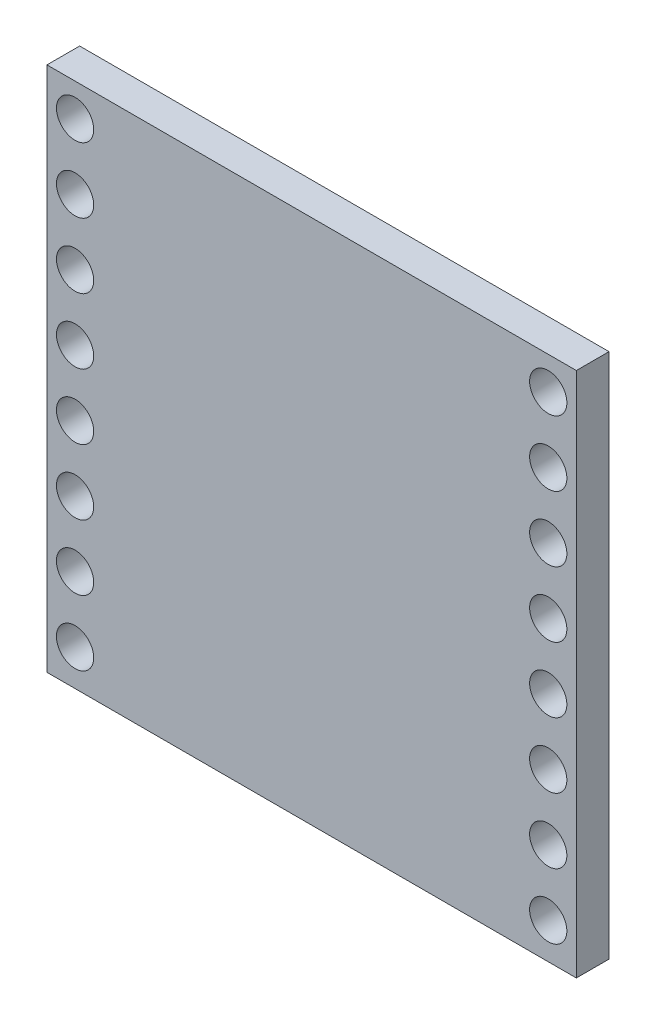
ISO-10303-21;
HEADER;
FILE_DESCRIPTION(('STEP AP214'),'2;1');
FILE_NAME('part.step','',(''),(''),'','','');
FILE_SCHEMA(('AUTOMOTIVE_DESIGN { 1 0 10303 214 1 1 1 1 }'));
ENDSEC;
DATA;
#1=APPLICATION_CONTEXT('core data for automotive mechanical design processes');
#2=APPLICATION_PROTOCOL_DEFINITION('international standard','automotive_design',2000,#1);
#3=PRODUCT_CONTEXT('',#1,'mechanical');
#4=PRODUCT('Part','Part','',(#3));
#5=PRODUCT_RELATED_PRODUCT_CATEGORY('part','',(#4));
#6=PRODUCT_DEFINITION_FORMATION('','',#4);
#7=PRODUCT_DEFINITION_CONTEXT('part definition',#1,'design');
#8=PRODUCT_DEFINITION('design','',#6,#7);
#9=PRODUCT_DEFINITION_SHAPE('','',#8);
#10=(LENGTH_UNIT() NAMED_UNIT(*) SI_UNIT(.MILLI.,.METRE.));
#11=(NAMED_UNIT(*) PLANE_ANGLE_UNIT() SI_UNIT($,.RADIAN.));
#12=(NAMED_UNIT(*) SI_UNIT($,.STERADIAN.) SOLID_ANGLE_UNIT());
#13=UNCERTAINTY_MEASURE_WITH_UNIT(LENGTH_MEASURE(1.E-05),#10,'distance_accuracy_value','');
#14=(GEOMETRIC_REPRESENTATION_CONTEXT(3) GLOBAL_UNCERTAINTY_ASSIGNED_CONTEXT((#13)) GLOBAL_UNIT_ASSIGNED_CONTEXT((#10,
#11,#12)) REPRESENTATION_CONTEXT('',''));
#15=CARTESIAN_POINT('',(0.,0.,0.));
#16=DIRECTION('',(0.,0.,1.));
#17=DIRECTION('',(1.,0.,0.));
#18=AXIS2_PLACEMENT_3D('',#15,#16,#17);
#19=CARTESIAN_POINT('',(0.,0.,1.));
#20=DIRECTION('',(0.,0.,1.));
#21=DIRECTION('',(1.,0.,0.));
#22=AXIS2_PLACEMENT_3D('',#19,#20,#21);
#23=PLANE('',#22);
#24=CARTESIAN_POINT('',(7.23999999999998,5.05,1.));
#25=DIRECTION('',(0.,0.,1.));
#26=DIRECTION('',(-1.,0.,0.));
#27=AXIS2_PLACEMENT_3D('',#24,#25,#26);
#28=CIRCLE('',#27,0.57);
#29=CARTESIAN_POINT('',(6.66999999999998,5.05,1.));
#30=VERTEX_POINT('',#29);
#31=EDGE_CURVE('E238',#30,#30,#28,.T.);
#32=ORIENTED_EDGE('',*,*,#31,.F.);
#33=EDGE_LOOP('',(#32));
#34=FACE_BOUND('',#33,.T.);
#35=CARTESIAN_POINT('',(7.23999999999994,1.05,1.));
#36=DIRECTION('',(0.,0.,1.));
#37=DIRECTION('',(-1.,0.,0.));
#38=AXIS2_PLACEMENT_3D('',#35,#36,#37);
#39=CIRCLE('',#38,0.57);
#40=CARTESIAN_POINT('',(6.66999999999994,1.05,1.));
#41=VERTEX_POINT('',#40);
#42=EDGE_CURVE('E222',#41,#41,#39,.T.);
#43=ORIENTED_EDGE('',*,*,#42,.F.);
#44=EDGE_LOOP('',(#43));
#45=FACE_BOUND('',#44,.T.);
#46=CARTESIAN_POINT('',(7.2399999999999,-2.95,1.));
#47=DIRECTION('',(0.,0.,1.));
#48=DIRECTION('',(-1.,0.,0.));
#49=AXIS2_PLACEMENT_3D('',#46,#47,#48);
#50=CIRCLE('',#49,0.57);
#51=CARTESIAN_POINT('',(6.6699999999999,-2.95,1.));
#52=VERTEX_POINT('',#51);
#53=EDGE_CURVE('E206',#52,#52,#50,.T.);
#54=ORIENTED_EDGE('',*,*,#53,.F.);
#55=EDGE_LOOP('',(#54));
#56=FACE_BOUND('',#55,.T.);
#57=CARTESIAN_POINT('',(-7.23999999999985,-6.95,1.));
#58=DIRECTION('',(0.,0.,1.));
#59=DIRECTION('',(1.,0.,0.));
#60=AXIS2_PLACEMENT_3D('',#57,#58,#59);
#61=CIRCLE('',#60,0.57);
#62=CARTESIAN_POINT('',(-6.66999999999985,-6.95,1.));
#63=VERTEX_POINT('',#62);
#64=EDGE_CURVE('E190',#63,#63,#61,.T.);
#65=ORIENTED_EDGE('',*,*,#64,.F.);
#66=EDGE_LOOP('',(#65));
#67=FACE_BOUND('',#66,.T.);
#68=CARTESIAN_POINT('',(-7.23999999999989,-2.95,1.));
#69=DIRECTION('',(0.,0.,1.));
#70=DIRECTION('',(1.,0.,0.));
#71=AXIS2_PLACEMENT_3D('',#68,#69,#70);
#72=CIRCLE('',#71,0.57);
#73=CARTESIAN_POINT('',(-6.66999999999989,-2.95,1.));
#74=VERTEX_POINT('',#73);
#75=EDGE_CURVE('E174',#74,#74,#72,.T.);
#76=ORIENTED_EDGE('',*,*,#75,.F.);
#77=EDGE_LOOP('',(#76));
#78=FACE_BOUND('',#77,.T.);
#79=CARTESIAN_POINT('',(-7.23999999999994,1.05,1.));
#80=DIRECTION('',(0.,0.,1.));
#81=DIRECTION('',(1.,0.,0.));
#82=AXIS2_PLACEMENT_3D('',#79,#80,#81);
#83=CIRCLE('',#82,0.57);
#84=CARTESIAN_POINT('',(-6.66999999999994,1.05,1.));
#85=VERTEX_POINT('',#84);
#86=EDGE_CURVE('E158',#85,#85,#83,.T.);
#87=ORIENTED_EDGE('',*,*,#86,.F.);
#88=EDGE_LOOP('',(#87));
#89=FACE_BOUND('',#88,.T.);
#90=CARTESIAN_POINT('',(-7.23999999999998,5.05,1.));
#91=DIRECTION('',(0.,0.,1.));
#92=DIRECTION('',(1.,0.,0.));
#93=AXIS2_PLACEMENT_3D('',#90,#91,#92);
#94=CIRCLE('',#93,0.57);
#95=CARTESIAN_POINT('',(-6.66999999999998,5.05,1.));
#96=VERTEX_POINT('',#95);
#97=EDGE_CURVE('E142',#96,#96,#94,.T.);
#98=ORIENTED_EDGE('',*,*,#97,.F.);
#99=EDGE_LOOP('',(#98));
#100=FACE_BOUND('',#99,.T.);
#101=CARTESIAN_POINT('',(-7.24,7.05,1.));
#102=DIRECTION('',(0.,0.,1.));
#103=DIRECTION('',(1.,0.,0.));
#104=AXIS2_PLACEMENT_3D('',#101,#102,#103);
#105=CIRCLE('',#104,0.57);
#106=CARTESIAN_POINT('',(-6.67,7.05,1.));
#107=VERTEX_POINT('',#106);
#108=EDGE_CURVE('E112',#107,#107,#105,.T.);
#109=ORIENTED_EDGE('',*,*,#108,.F.);
#110=EDGE_LOOP('',(#109));
#111=FACE_BOUND('',#110,.T.);
#112=DIRECTION('',(0.,-1.,0.));
#113=VECTOR('',#112,1.);
#114=CARTESIAN_POINT('',(-8.1,-8.05,1.));
#115=LINE('',#114,#113);
#116=CARTESIAN_POINT('',(-8.1,8.05,1.));
#117=VERTEX_POINT('',#116);
#118=CARTESIAN_POINT('',(-8.1,-8.05,1.));
#119=VERTEX_POINT('',#118);
#120=EDGE_CURVE('E92',#117,#119,#115,.T.);
#121=ORIENTED_EDGE('',*,*,#120,.T.);
#122=DIRECTION('',(1.,0.,0.));
#123=VECTOR('',#122,1.);
#124=CARTESIAN_POINT('',(8.1,-8.05,1.));
#125=LINE('',#124,#123);
#126=CARTESIAN_POINT('',(8.1,-8.05,1.));
#127=VERTEX_POINT('',#126);
#128=EDGE_CURVE('E87',#119,#127,#125,.T.);
#129=ORIENTED_EDGE('',*,*,#128,.T.);
#130=DIRECTION('',(0.,1.,0.));
#131=VECTOR('',#130,1.);
#132=CARTESIAN_POINT('',(8.1,-8.05,1.));
#133=LINE('',#132,#131);
#134=CARTESIAN_POINT('',(8.1,8.05,1.));
#135=VERTEX_POINT('',#134);
#136=EDGE_CURVE('E90',#127,#135,#133,.T.);
#137=ORIENTED_EDGE('',*,*,#136,.T.);
#138=DIRECTION('',(-1.,0.,0.));
#139=VECTOR('',#138,1.);
#140=CARTESIAN_POINT('',(8.1,8.05,1.));
#141=LINE('',#140,#139);
#142=EDGE_CURVE('E57',#135,#117,#141,.T.);
#143=ORIENTED_EDGE('',*,*,#142,.T.);
#144=EDGE_LOOP('',(#121,#129,#137,#143));
#145=FACE_BOUND('',#144,.T.);
#146=CARTESIAN_POINT('',(7.23999999999986,-6.95,1.));
#147=DIRECTION('',(0.,0.,1.));
#148=DIRECTION('',(-1.,0.,0.));
#149=AXIS2_PLACEMENT_3D('',#146,#147,#148);
#150=CIRCLE('',#149,0.57);
#151=CARTESIAN_POINT('',(6.66999999999986,-6.95,1.));
#152=VERTEX_POINT('',#151);
#153=EDGE_CURVE('E134',#152,#152,#150,.T.);
#154=ORIENTED_EDGE('',*,*,#153,.F.);
#155=EDGE_LOOP('',(#154));
#156=FACE_BOUND('',#155,.T.);
#157=CARTESIAN_POINT('',(-7.23999999999996,3.05,1.));
#158=DIRECTION('',(0.,0.,1.));
#159=DIRECTION('',(1.,0.,0.));
#160=AXIS2_PLACEMENT_3D('',#157,#158,#159);
#161=CIRCLE('',#160,0.57);
#162=CARTESIAN_POINT('',(-6.66999999999996,3.05,1.));
#163=VERTEX_POINT('',#162);
#164=EDGE_CURVE('E150',#163,#163,#161,.T.);
#165=ORIENTED_EDGE('',*,*,#164,.F.);
#166=EDGE_LOOP('',(#165));
#167=FACE_BOUND('',#166,.T.);
#168=CARTESIAN_POINT('',(-7.23999999999991,-0.950000000000003,1.));
#169=DIRECTION('',(0.,0.,1.));
#170=DIRECTION('',(1.,0.,0.));
#171=AXIS2_PLACEMENT_3D('',#168,#169,#170);
#172=CIRCLE('',#171,0.57);
#173=CARTESIAN_POINT('',(-6.66999999999991,-0.950000000000003,1.));
#174=VERTEX_POINT('',#173);
#175=EDGE_CURVE('E166',#174,#174,#172,.T.);
#176=ORIENTED_EDGE('',*,*,#175,.F.);
#177=EDGE_LOOP('',(#176));
#178=FACE_BOUND('',#177,.T.);
#179=CARTESIAN_POINT('',(-7.23999999999987,-4.95,1.));
#180=DIRECTION('',(0.,0.,1.));
#181=DIRECTION('',(1.,0.,0.));
#182=AXIS2_PLACEMENT_3D('',#179,#180,#181);
#183=CIRCLE('',#182,0.57);
#184=CARTESIAN_POINT('',(-6.66999999999987,-4.95,1.));
#185=VERTEX_POINT('',#184);
#186=EDGE_CURVE('E182',#185,#185,#183,.T.);
#187=ORIENTED_EDGE('',*,*,#186,.F.);
#188=EDGE_LOOP('',(#187));
#189=FACE_BOUND('',#188,.T.);
#190=CARTESIAN_POINT('',(7.23999999999988,-4.95,1.));
#191=DIRECTION('',(0.,0.,1.));
#192=DIRECTION('',(-1.,0.,0.));
#193=AXIS2_PLACEMENT_3D('',#190,#191,#192);
#194=CIRCLE('',#193,0.57);
#195=CARTESIAN_POINT('',(6.66999999999988,-4.95,1.));
#196=VERTEX_POINT('',#195);
#197=EDGE_CURVE('E198',#196,#196,#194,.T.);
#198=ORIENTED_EDGE('',*,*,#197,.F.);
#199=EDGE_LOOP('',(#198));
#200=FACE_BOUND('',#199,.T.);
#201=CARTESIAN_POINT('',(7.23999999999992,-0.950000000000003,1.));
#202=DIRECTION('',(0.,0.,1.));
#203=DIRECTION('',(-1.,0.,0.));
#204=AXIS2_PLACEMENT_3D('',#201,#202,#203);
#205=CIRCLE('',#204,0.57);
#206=CARTESIAN_POINT('',(6.66999999999992,-0.950000000000003,1.));
#207=VERTEX_POINT('',#206);
#208=EDGE_CURVE('E214',#207,#207,#205,.T.);
#209=ORIENTED_EDGE('',*,*,#208,.F.);
#210=EDGE_LOOP('',(#209));
#211=FACE_BOUND('',#210,.T.);
#212=CARTESIAN_POINT('',(7.23999999999996,3.05,1.));
#213=DIRECTION('',(0.,0.,1.));
#214=DIRECTION('',(-1.,0.,0.));
#215=AXIS2_PLACEMENT_3D('',#212,#213,#214);
#216=CIRCLE('',#215,0.57);
#217=CARTESIAN_POINT('',(6.66999999999996,3.05,1.));
#218=VERTEX_POINT('',#217);
#219=EDGE_CURVE('E230',#218,#218,#216,.T.);
#220=ORIENTED_EDGE('',*,*,#219,.F.);
#221=EDGE_LOOP('',(#220));
#222=FACE_BOUND('',#221,.T.);
#223=CARTESIAN_POINT('',(7.24,7.05,1.));
#224=DIRECTION('',(0.,0.,1.));
#225=DIRECTION('',(-1.,0.,0.));
#226=AXIS2_PLACEMENT_3D('',#223,#224,#225);
#227=CIRCLE('',#226,0.57);
#228=CARTESIAN_POINT('',(6.67,7.05,1.));
#229=VERTEX_POINT('',#228);
#230=EDGE_CURVE('E246',#229,#229,#227,.T.);
#231=ORIENTED_EDGE('',*,*,#230,.F.);
#232=EDGE_LOOP('',(#231));
#233=FACE_BOUND('',#232,.T.);
#234=ADVANCED_FACE('F39',(#34,#45,#56,#67,#78,#89,#100,#111,#145,#156,#167,#178,#189,#200,#211,
#222,#233),#23,.T.);
#235=CARTESIAN_POINT('',(0.,0.,0.));
#236=DIRECTION('',(0.,0.,1.));
#237=DIRECTION('',(1.,0.,0.));
#238=AXIS2_PLACEMENT_3D('',#235,#236,#237);
#239=PLANE('',#238);
#240=DIRECTION('',(0.,-1.,0.));
#241=VECTOR('',#240,1.);
#242=CARTESIAN_POINT('',(-8.1,-8.05,0.));
#243=LINE('',#242,#241);
#244=CARTESIAN_POINT('',(-8.1,8.05,0.));
#245=VERTEX_POINT('',#244);
#246=CARTESIAN_POINT('',(-8.1,-8.05,0.));
#247=VERTEX_POINT('',#246);
#248=EDGE_CURVE('E108',#245,#247,#243,.T.);
#249=ORIENTED_EDGE('',*,*,#248,.F.);
#250=DIRECTION('',(-1.,0.,0.));
#251=VECTOR('',#250,1.);
#252=CARTESIAN_POINT('',(8.1,8.05,0.));
#253=LINE('',#252,#251);
#254=CARTESIAN_POINT('',(8.1,8.05,0.));
#255=VERTEX_POINT('',#254);
#256=EDGE_CURVE('E80',#255,#245,#253,.T.);
#257=ORIENTED_EDGE('',*,*,#256,.F.);
#258=DIRECTION('',(0.,1.,0.));
#259=VECTOR('',#258,1.);
#260=CARTESIAN_POINT('',(8.1,-8.05,0.));
#261=LINE('',#260,#259);
#262=CARTESIAN_POINT('',(8.1,-8.05,0.));
#263=VERTEX_POINT('',#262);
#264=EDGE_CURVE('E74',#263,#255,#261,.T.);
#265=ORIENTED_EDGE('',*,*,#264,.F.);
#266=DIRECTION('',(1.,0.,0.));
#267=VECTOR('',#266,1.);
#268=CARTESIAN_POINT('',(8.1,-8.05,0.));
#269=LINE('',#268,#267);
#270=EDGE_CURVE('E97',#247,#263,#269,.T.);
#271=ORIENTED_EDGE('',*,*,#270,.F.);
#272=EDGE_LOOP('',(#249,#257,#265,#271));
#273=FACE_BOUND('',#272,.T.);
#274=CARTESIAN_POINT('',(-7.24,7.05,0.));
#275=DIRECTION('',(0.,0.,1.));
#276=DIRECTION('',(1.,0.,0.));
#277=AXIS2_PLACEMENT_3D('',#274,#275,#276);
#278=CIRCLE('',#277,0.57);
#279=CARTESIAN_POINT('',(-6.67,7.05,0.));
#280=VERTEX_POINT('',#279);
#281=EDGE_CURVE('E130',#280,#280,#278,.T.);
#282=ORIENTED_EDGE('',*,*,#281,.T.);
#283=EDGE_LOOP('',(#282));
#284=FACE_BOUND('',#283,.T.);
#285=CARTESIAN_POINT('',(7.23999999999986,-6.95,0.));
#286=DIRECTION('',(0.,0.,1.));
#287=DIRECTION('',(-1.,0.,0.));
#288=AXIS2_PLACEMENT_3D('',#285,#286,#287);
#289=CIRCLE('',#288,0.57);
#290=CARTESIAN_POINT('',(6.66999999999986,-6.95,0.));
#291=VERTEX_POINT('',#290);
#292=EDGE_CURVE('E138',#291,#291,#289,.T.);
#293=ORIENTED_EDGE('',*,*,#292,.T.);
#294=EDGE_LOOP('',(#293));
#295=FACE_BOUND('',#294,.T.);
#296=CARTESIAN_POINT('',(-7.23999999999998,5.05,0.));
#297=DIRECTION('',(0.,0.,1.));
#298=DIRECTION('',(1.,0.,0.));
#299=AXIS2_PLACEMENT_3D('',#296,#297,#298);
#300=CIRCLE('',#299,0.57);
#301=CARTESIAN_POINT('',(-6.66999999999998,5.05,0.));
#302=VERTEX_POINT('',#301);
#303=EDGE_CURVE('E146',#302,#302,#300,.T.);
#304=ORIENTED_EDGE('',*,*,#303,.T.);
#305=EDGE_LOOP('',(#304));
#306=FACE_BOUND('',#305,.T.);
#307=CARTESIAN_POINT('',(-7.23999999999996,3.05,0.));
#308=DIRECTION('',(0.,0.,1.));
#309=DIRECTION('',(1.,0.,0.));
#310=AXIS2_PLACEMENT_3D('',#307,#308,#309);
#311=CIRCLE('',#310,0.57);
#312=CARTESIAN_POINT('',(-6.66999999999996,3.05,0.));
#313=VERTEX_POINT('',#312);
#314=EDGE_CURVE('E154',#313,#313,#311,.T.);
#315=ORIENTED_EDGE('',*,*,#314,.T.);
#316=EDGE_LOOP('',(#315));
#317=FACE_BOUND('',#316,.T.);
#318=CARTESIAN_POINT('',(-7.23999999999994,1.05,0.));
#319=DIRECTION('',(0.,0.,1.));
#320=DIRECTION('',(1.,0.,0.));
#321=AXIS2_PLACEMENT_3D('',#318,#319,#320);
#322=CIRCLE('',#321,0.57);
#323=CARTESIAN_POINT('',(-6.66999999999994,1.05,0.));
#324=VERTEX_POINT('',#323);
#325=EDGE_CURVE('E162',#324,#324,#322,.T.);
#326=ORIENTED_EDGE('',*,*,#325,.T.);
#327=EDGE_LOOP('',(#326));
#328=FACE_BOUND('',#327,.T.);
#329=CARTESIAN_POINT('',(-7.23999999999991,-0.950000000000003,0.));
#330=DIRECTION('',(0.,0.,1.));
#331=DIRECTION('',(1.,0.,0.));
#332=AXIS2_PLACEMENT_3D('',#329,#330,#331);
#333=CIRCLE('',#332,0.57);
#334=CARTESIAN_POINT('',(-6.66999999999991,-0.950000000000003,0.));
#335=VERTEX_POINT('',#334);
#336=EDGE_CURVE('E170',#335,#335,#333,.T.);
#337=ORIENTED_EDGE('',*,*,#336,.T.);
#338=EDGE_LOOP('',(#337));
#339=FACE_BOUND('',#338,.T.);
#340=CARTESIAN_POINT('',(-7.23999999999989,-2.95,0.));
#341=DIRECTION('',(0.,0.,1.));
#342=DIRECTION('',(1.,0.,0.));
#343=AXIS2_PLACEMENT_3D('',#340,#341,#342);
#344=CIRCLE('',#343,0.57);
#345=CARTESIAN_POINT('',(-6.66999999999989,-2.95,0.));
#346=VERTEX_POINT('',#345);
#347=EDGE_CURVE('E178',#346,#346,#344,.T.);
#348=ORIENTED_EDGE('',*,*,#347,.T.);
#349=EDGE_LOOP('',(#348));
#350=FACE_BOUND('',#349,.T.);
#351=CARTESIAN_POINT('',(-7.23999999999987,-4.95,0.));
#352=DIRECTION('',(0.,0.,1.));
#353=DIRECTION('',(1.,0.,0.));
#354=AXIS2_PLACEMENT_3D('',#351,#352,#353);
#355=CIRCLE('',#354,0.57);
#356=CARTESIAN_POINT('',(-6.66999999999987,-4.95,0.));
#357=VERTEX_POINT('',#356);
#358=EDGE_CURVE('E186',#357,#357,#355,.T.);
#359=ORIENTED_EDGE('',*,*,#358,.T.);
#360=EDGE_LOOP('',(#359));
#361=FACE_BOUND('',#360,.T.);
#362=CARTESIAN_POINT('',(-7.23999999999985,-6.95,0.));
#363=DIRECTION('',(0.,0.,1.));
#364=DIRECTION('',(1.,0.,0.));
#365=AXIS2_PLACEMENT_3D('',#362,#363,#364);
#366=CIRCLE('',#365,0.57);
#367=CARTESIAN_POINT('',(-6.66999999999985,-6.95,0.));
#368=VERTEX_POINT('',#367);
#369=EDGE_CURVE('E194',#368,#368,#366,.T.);
#370=ORIENTED_EDGE('',*,*,#369,.T.);
#371=EDGE_LOOP('',(#370));
#372=FACE_BOUND('',#371,.T.);
#373=CARTESIAN_POINT('',(7.23999999999988,-4.95,0.));
#374=DIRECTION('',(0.,0.,1.));
#375=DIRECTION('',(-1.,0.,0.));
#376=AXIS2_PLACEMENT_3D('',#373,#374,#375);
#377=CIRCLE('',#376,0.57);
#378=CARTESIAN_POINT('',(6.66999999999988,-4.95,0.));
#379=VERTEX_POINT('',#378);
#380=EDGE_CURVE('E202',#379,#379,#377,.T.);
#381=ORIENTED_EDGE('',*,*,#380,.T.);
#382=EDGE_LOOP('',(#381));
#383=FACE_BOUND('',#382,.T.);
#384=CARTESIAN_POINT('',(7.2399999999999,-2.95,0.));
#385=DIRECTION('',(0.,0.,1.));
#386=DIRECTION('',(-1.,0.,0.));
#387=AXIS2_PLACEMENT_3D('',#384,#385,#386);
#388=CIRCLE('',#387,0.57);
#389=CARTESIAN_POINT('',(6.6699999999999,-2.95,0.));
#390=VERTEX_POINT('',#389);
#391=EDGE_CURVE('E210',#390,#390,#388,.T.);
#392=ORIENTED_EDGE('',*,*,#391,.T.);
#393=EDGE_LOOP('',(#392));
#394=FACE_BOUND('',#393,.T.);
#395=CARTESIAN_POINT('',(7.23999999999992,-0.950000000000003,0.));
#396=DIRECTION('',(0.,0.,1.));
#397=DIRECTION('',(-1.,0.,0.));
#398=AXIS2_PLACEMENT_3D('',#395,#396,#397);
#399=CIRCLE('',#398,0.57);
#400=CARTESIAN_POINT('',(6.66999999999992,-0.950000000000003,0.));
#401=VERTEX_POINT('',#400);
#402=EDGE_CURVE('E218',#401,#401,#399,.T.);
#403=ORIENTED_EDGE('',*,*,#402,.T.);
#404=EDGE_LOOP('',(#403));
#405=FACE_BOUND('',#404,.T.);
#406=CARTESIAN_POINT('',(7.23999999999994,1.05,0.));
#407=DIRECTION('',(0.,0.,1.));
#408=DIRECTION('',(-1.,0.,0.));
#409=AXIS2_PLACEMENT_3D('',#406,#407,#408);
#410=CIRCLE('',#409,0.57);
#411=CARTESIAN_POINT('',(6.66999999999994,1.05,0.));
#412=VERTEX_POINT('',#411);
#413=EDGE_CURVE('E226',#412,#412,#410,.T.);
#414=ORIENTED_EDGE('',*,*,#413,.T.);
#415=EDGE_LOOP('',(#414));
#416=FACE_BOUND('',#415,.T.);
#417=CARTESIAN_POINT('',(7.23999999999996,3.05,0.));
#418=DIRECTION('',(0.,0.,1.));
#419=DIRECTION('',(-1.,0.,0.));
#420=AXIS2_PLACEMENT_3D('',#417,#418,#419);
#421=CIRCLE('',#420,0.57);
#422=CARTESIAN_POINT('',(6.66999999999996,3.05,0.));
#423=VERTEX_POINT('',#422);
#424=EDGE_CURVE('E234',#423,#423,#421,.T.);
#425=ORIENTED_EDGE('',*,*,#424,.T.);
#426=EDGE_LOOP('',(#425));
#427=FACE_BOUND('',#426,.T.);
#428=CARTESIAN_POINT('',(7.23999999999998,5.05,0.));
#429=DIRECTION('',(0.,0.,1.));
#430=DIRECTION('',(-1.,0.,0.));
#431=AXIS2_PLACEMENT_3D('',#428,#429,#430);
#432=CIRCLE('',#431,0.57);
#433=CARTESIAN_POINT('',(6.66999999999998,5.05,0.));
#434=VERTEX_POINT('',#433);
#435=EDGE_CURVE('E242',#434,#434,#432,.T.);
#436=ORIENTED_EDGE('',*,*,#435,.T.);
#437=EDGE_LOOP('',(#436));
#438=FACE_BOUND('',#437,.T.);
#439=CARTESIAN_POINT('',(7.24,7.05,0.));
#440=DIRECTION('',(0.,0.,1.));
#441=DIRECTION('',(-1.,0.,0.));
#442=AXIS2_PLACEMENT_3D('',#439,#440,#441);
#443=CIRCLE('',#442,0.57);
#444=CARTESIAN_POINT('',(6.67,7.05,0.));
#445=VERTEX_POINT('',#444);
#446=EDGE_CURVE('E250',#445,#445,#443,.T.);
#447=ORIENTED_EDGE('',*,*,#446,.T.);
#448=EDGE_LOOP('',(#447));
#449=FACE_BOUND('',#448,.T.);
#450=ADVANCED_FACE('F125',(#273,#284,#295,#306,#317,#328,#339,#350,#361,#372,#383,#394,#405,
#416,#427,#438,#449),#239,.F.);
#451=CARTESIAN_POINT('',(-8.1,-8.05,1.));
#452=DIRECTION('',(1.,0.,0.));
#453=DIRECTION('',(0.,0.,-1.));
#454=AXIS2_PLACEMENT_3D('',#451,#452,#453);
#455=PLANE('',#454);
#456=ORIENTED_EDGE('',*,*,#248,.T.);
#457=DIRECTION('',(0.,0.,-1.));
#458=VECTOR('',#457,1.);
#459=CARTESIAN_POINT('',(-8.1,-8.05,1.));
#460=LINE('',#459,#458);
#461=EDGE_CURVE('E11',#119,#247,#460,.T.);
#462=ORIENTED_EDGE('',*,*,#461,.F.);
#463=ORIENTED_EDGE('',*,*,#120,.F.);
#464=DIRECTION('',(0.,0.,-1.));
#465=VECTOR('',#464,1.);
#466=CARTESIAN_POINT('',(-8.1,8.05,1.));
#467=LINE('',#466,#465);
#468=EDGE_CURVE('E104',#117,#245,#467,.T.);
#469=ORIENTED_EDGE('',*,*,#468,.T.);
#470=EDGE_LOOP('',(#456,#462,#463,#469));
#471=FACE_BOUND('',#470,.T.);
#472=ADVANCED_FACE('F41',(#471),#455,.F.);
#473=CARTESIAN_POINT('',(8.1,-8.05,1.));
#474=DIRECTION('',(0.,1.,0.));
#475=DIRECTION('',(-1.,0.,0.));
#476=AXIS2_PLACEMENT_3D('',#473,#474,#475);
#477=PLANE('',#476);
#478=ORIENTED_EDGE('',*,*,#270,.T.);
#479=DIRECTION('',(0.,0.,-1.));
#480=VECTOR('',#479,1.);
#481=CARTESIAN_POINT('',(8.1,-8.05,1.));
#482=LINE('',#481,#480);
#483=EDGE_CURVE('E49',#127,#263,#482,.T.);
#484=ORIENTED_EDGE('',*,*,#483,.F.);
#485=ORIENTED_EDGE('',*,*,#128,.F.);
#486=ORIENTED_EDGE('',*,*,#461,.T.);
#487=EDGE_LOOP('',(#478,#484,#485,#486));
#488=FACE_BOUND('',#487,.T.);
#489=ADVANCED_FACE('F96',(#488),#477,.F.);
#490=CARTESIAN_POINT('',(8.1,-8.05,1.));
#491=DIRECTION('',(-1.,0.,0.));
#492=DIRECTION('',(0.,0.,1.));
#493=AXIS2_PLACEMENT_3D('',#490,#491,#492);
#494=PLANE('',#493);
#495=ORIENTED_EDGE('',*,*,#264,.T.);
#496=DIRECTION('',(0.,0.,-1.));
#497=VECTOR('',#496,1.);
#498=CARTESIAN_POINT('',(8.1,8.05,1.));
#499=LINE('',#498,#497);
#500=EDGE_CURVE('E99',#135,#255,#499,.T.);
#501=ORIENTED_EDGE('',*,*,#500,.F.);
#502=ORIENTED_EDGE('',*,*,#136,.F.);
#503=ORIENTED_EDGE('',*,*,#483,.T.);
#504=EDGE_LOOP('',(#495,#501,#502,#503));
#505=FACE_BOUND('',#504,.T.);
#506=ADVANCED_FACE('F100',(#505),#494,.F.);
#507=CARTESIAN_POINT('',(8.1,8.05,1.));
#508=DIRECTION('',(0.,-1.,0.));
#509=DIRECTION('',(1.,0.,0.));
#510=AXIS2_PLACEMENT_3D('',#507,#508,#509);
#511=PLANE('',#510);
#512=ORIENTED_EDGE('',*,*,#256,.T.);
#513=ORIENTED_EDGE('',*,*,#468,.F.);
#514=ORIENTED_EDGE('',*,*,#142,.F.);
#515=ORIENTED_EDGE('',*,*,#500,.T.);
#516=EDGE_LOOP('',(#512,#513,#514,#515));
#517=FACE_BOUND('',#516,.T.);
#518=ADVANCED_FACE('F122',(#517),#511,.F.);
#519=CARTESIAN_POINT('',(-7.24,7.05,1.));
#520=DIRECTION('',(0.,0.,-1.));
#521=DIRECTION('',(-1.,0.,0.));
#522=AXIS2_PLACEMENT_3D('',#519,#520,#521);
#523=CYLINDRICAL_SURFACE('',#522,0.57);
#524=ORIENTED_EDGE('',*,*,#108,.T.);
#525=EDGE_LOOP('',(#524));
#526=FACE_BOUND('',#525,.T.);
#527=ORIENTED_EDGE('',*,*,#281,.F.);
#528=EDGE_LOOP('',(#527));
#529=FACE_BOUND('',#528,.T.);
#530=ADVANCED_FACE('F271',(#526,#529),#523,.F.);
#531=CARTESIAN_POINT('',(7.23999999999986,-6.95,1.));
#532=DIRECTION('',(0.,0.,-1.));
#533=DIRECTION('',(-1.,0.,0.));
#534=AXIS2_PLACEMENT_3D('',#531,#532,#533);
#535=CYLINDRICAL_SURFACE('',#534,0.57);
#536=ORIENTED_EDGE('',*,*,#153,.T.);
#537=EDGE_LOOP('',(#536));
#538=FACE_BOUND('',#537,.T.);
#539=ORIENTED_EDGE('',*,*,#292,.F.);
#540=EDGE_LOOP('',(#539));
#541=FACE_BOUND('',#540,.T.);
#542=ADVANCED_FACE('F317',(#538,#541),#535,.F.);
#543=CARTESIAN_POINT('',(-7.23999999999998,5.05,1.));
#544=DIRECTION('',(0.,0.,-1.));
#545=DIRECTION('',(-1.,0.,0.));
#546=AXIS2_PLACEMENT_3D('',#543,#544,#545);
#547=CYLINDRICAL_SURFACE('',#546,0.57);
#548=ORIENTED_EDGE('',*,*,#97,.T.);
#549=EDGE_LOOP('',(#548));
#550=FACE_BOUND('',#549,.T.);
#551=ORIENTED_EDGE('',*,*,#303,.F.);
#552=EDGE_LOOP('',(#551));
#553=FACE_BOUND('',#552,.T.);
#554=ADVANCED_FACE('F325',(#550,#553),#547,.F.);
#555=CARTESIAN_POINT('',(-7.23999999999996,3.05,1.));
#556=DIRECTION('',(0.,0.,-1.));
#557=DIRECTION('',(-1.,0.,0.));
#558=AXIS2_PLACEMENT_3D('',#555,#556,#557);
#559=CYLINDRICAL_SURFACE('',#558,0.57);
#560=ORIENTED_EDGE('',*,*,#164,.T.);
#561=EDGE_LOOP('',(#560));
#562=FACE_BOUND('',#561,.T.);
#563=ORIENTED_EDGE('',*,*,#314,.F.);
#564=EDGE_LOOP('',(#563));
#565=FACE_BOUND('',#564,.T.);
#566=ADVANCED_FACE('F333',(#562,#565),#559,.F.);
#567=CARTESIAN_POINT('',(-7.23999999999994,1.05,1.));
#568=DIRECTION('',(0.,0.,-1.));
#569=DIRECTION('',(-1.,0.,0.));
#570=AXIS2_PLACEMENT_3D('',#567,#568,#569);
#571=CYLINDRICAL_SURFACE('',#570,0.57);
#572=ORIENTED_EDGE('',*,*,#86,.T.);
#573=EDGE_LOOP('',(#572));
#574=FACE_BOUND('',#573,.T.);
#575=ORIENTED_EDGE('',*,*,#325,.F.);
#576=EDGE_LOOP('',(#575));
#577=FACE_BOUND('',#576,.T.);
#578=ADVANCED_FACE('F342',(#574,#577),#571,.F.);
#579=CARTESIAN_POINT('',(-7.23999999999991,-0.950000000000003,1.));
#580=DIRECTION('',(0.,0.,-1.));
#581=DIRECTION('',(-1.,0.,0.));
#582=AXIS2_PLACEMENT_3D('',#579,#580,#581);
#583=CYLINDRICAL_SURFACE('',#582,0.57);
#584=ORIENTED_EDGE('',*,*,#175,.T.);
#585=EDGE_LOOP('',(#584));
#586=FACE_BOUND('',#585,.T.);
#587=ORIENTED_EDGE('',*,*,#336,.F.);
#588=EDGE_LOOP('',(#587));
#589=FACE_BOUND('',#588,.T.);
#590=ADVANCED_FACE('F351',(#586,#589),#583,.F.);
#591=CARTESIAN_POINT('',(-7.23999999999989,-2.95,1.));
#592=DIRECTION('',(0.,0.,-1.));
#593=DIRECTION('',(-1.,0.,0.));
#594=AXIS2_PLACEMENT_3D('',#591,#592,#593);
#595=CYLINDRICAL_SURFACE('',#594,0.57);
#596=ORIENTED_EDGE('',*,*,#75,.T.);
#597=EDGE_LOOP('',(#596));
#598=FACE_BOUND('',#597,.T.);
#599=ORIENTED_EDGE('',*,*,#347,.F.);
#600=EDGE_LOOP('',(#599));
#601=FACE_BOUND('',#600,.T.);
#602=ADVANCED_FACE('F360',(#598,#601),#595,.F.);
#603=CARTESIAN_POINT('',(-7.23999999999987,-4.95,1.));
#604=DIRECTION('',(0.,0.,-1.));
#605=DIRECTION('',(-1.,0.,0.));
#606=AXIS2_PLACEMENT_3D('',#603,#604,#605);
#607=CYLINDRICAL_SURFACE('',#606,0.57);
#608=ORIENTED_EDGE('',*,*,#186,.T.);
#609=EDGE_LOOP('',(#608));
#610=FACE_BOUND('',#609,.T.);
#611=ORIENTED_EDGE('',*,*,#358,.F.);
#612=EDGE_LOOP('',(#611));
#613=FACE_BOUND('',#612,.T.);
#614=ADVANCED_FACE('F369',(#610,#613),#607,.F.);
#615=CARTESIAN_POINT('',(-7.23999999999985,-6.95,1.));
#616=DIRECTION('',(0.,0.,-1.));
#617=DIRECTION('',(-1.,0.,0.));
#618=AXIS2_PLACEMENT_3D('',#615,#616,#617);
#619=CYLINDRICAL_SURFACE('',#618,0.57);
#620=ORIENTED_EDGE('',*,*,#64,.T.);
#621=EDGE_LOOP('',(#620));
#622=FACE_BOUND('',#621,.T.);
#623=ORIENTED_EDGE('',*,*,#369,.F.);
#624=EDGE_LOOP('',(#623));
#625=FACE_BOUND('',#624,.T.);
#626=ADVANCED_FACE('F378',(#622,#625),#619,.F.);
#627=CARTESIAN_POINT('',(7.23999999999988,-4.95,1.));
#628=DIRECTION('',(0.,0.,-1.));
#629=DIRECTION('',(-1.,0.,0.));
#630=AXIS2_PLACEMENT_3D('',#627,#628,#629);
#631=CYLINDRICAL_SURFACE('',#630,0.57);
#632=ORIENTED_EDGE('',*,*,#197,.T.);
#633=EDGE_LOOP('',(#632));
#634=FACE_BOUND('',#633,.T.);
#635=ORIENTED_EDGE('',*,*,#380,.F.);
#636=EDGE_LOOP('',(#635));
#637=FACE_BOUND('',#636,.T.);
#638=ADVANCED_FACE('F387',(#634,#637),#631,.F.);
#639=CARTESIAN_POINT('',(7.2399999999999,-2.95,1.));
#640=DIRECTION('',(0.,0.,-1.));
#641=DIRECTION('',(-1.,0.,0.));
#642=AXIS2_PLACEMENT_3D('',#639,#640,#641);
#643=CYLINDRICAL_SURFACE('',#642,0.57);
#644=ORIENTED_EDGE('',*,*,#53,.T.);
#645=EDGE_LOOP('',(#644));
#646=FACE_BOUND('',#645,.T.);
#647=ORIENTED_EDGE('',*,*,#391,.F.);
#648=EDGE_LOOP('',(#647));
#649=FACE_BOUND('',#648,.T.);
#650=ADVANCED_FACE('F396',(#646,#649),#643,.F.);
#651=CARTESIAN_POINT('',(7.23999999999992,-0.950000000000003,1.));
#652=DIRECTION('',(0.,0.,-1.));
#653=DIRECTION('',(-1.,0.,0.));
#654=AXIS2_PLACEMENT_3D('',#651,#652,#653);
#655=CYLINDRICAL_SURFACE('',#654,0.57);
#656=ORIENTED_EDGE('',*,*,#208,.T.);
#657=EDGE_LOOP('',(#656));
#658=FACE_BOUND('',#657,.T.);
#659=ORIENTED_EDGE('',*,*,#402,.F.);
#660=EDGE_LOOP('',(#659));
#661=FACE_BOUND('',#660,.T.);
#662=ADVANCED_FACE('F405',(#658,#661),#655,.F.);
#663=CARTESIAN_POINT('',(7.23999999999994,1.05,1.));
#664=DIRECTION('',(0.,0.,-1.));
#665=DIRECTION('',(-1.,0.,0.));
#666=AXIS2_PLACEMENT_3D('',#663,#664,#665);
#667=CYLINDRICAL_SURFACE('',#666,0.57);
#668=ORIENTED_EDGE('',*,*,#42,.T.);
#669=EDGE_LOOP('',(#668));
#670=FACE_BOUND('',#669,.T.);
#671=ORIENTED_EDGE('',*,*,#413,.F.);
#672=EDGE_LOOP('',(#671));
#673=FACE_BOUND('',#672,.T.);
#674=ADVANCED_FACE('F414',(#670,#673),#667,.F.);
#675=CARTESIAN_POINT('',(7.23999999999996,3.05,1.));
#676=DIRECTION('',(0.,0.,-1.));
#677=DIRECTION('',(-1.,0.,0.));
#678=AXIS2_PLACEMENT_3D('',#675,#676,#677);
#679=CYLINDRICAL_SURFACE('',#678,0.57);
#680=ORIENTED_EDGE('',*,*,#219,.T.);
#681=EDGE_LOOP('',(#680));
#682=FACE_BOUND('',#681,.T.);
#683=ORIENTED_EDGE('',*,*,#424,.F.);
#684=EDGE_LOOP('',(#683));
#685=FACE_BOUND('',#684,.T.);
#686=ADVANCED_FACE('F423',(#682,#685),#679,.F.);
#687=CARTESIAN_POINT('',(7.23999999999998,5.05,1.));
#688=DIRECTION('',(0.,0.,-1.));
#689=DIRECTION('',(-1.,0.,0.));
#690=AXIS2_PLACEMENT_3D('',#687,#688,#689);
#691=CYLINDRICAL_SURFACE('',#690,0.57);
#692=ORIENTED_EDGE('',*,*,#31,.T.);
#693=EDGE_LOOP('',(#692));
#694=FACE_BOUND('',#693,.T.);
#695=ORIENTED_EDGE('',*,*,#435,.F.);
#696=EDGE_LOOP('',(#695));
#697=FACE_BOUND('',#696,.T.);
#698=ADVANCED_FACE('F432',(#694,#697),#691,.F.);
#699=CARTESIAN_POINT('',(7.24,7.05,1.));
#700=DIRECTION('',(0.,0.,-1.));
#701=DIRECTION('',(-1.,0.,0.));
#702=AXIS2_PLACEMENT_3D('',#699,#700,#701);
#703=CYLINDRICAL_SURFACE('',#702,0.57);
#704=ORIENTED_EDGE('',*,*,#230,.T.);
#705=EDGE_LOOP('',(#704));
#706=FACE_BOUND('',#705,.T.);
#707=ORIENTED_EDGE('',*,*,#446,.F.);
#708=EDGE_LOOP('',(#707));
#709=FACE_BOUND('',#708,.T.);
#710=ADVANCED_FACE('F258',(#706,#709),#703,.F.);
#711=CLOSED_SHELL('',(#234,#450,#472,#489,#506,#518,#530,#542,#554,#566,#578,#590,#602,#614,
#626,#638,#650,#662,#674,#686,#698,#710));
#712=MANIFOLD_SOLID_BREP('B2',#711);
#713=ADVANCED_BREP_SHAPE_REPRESENTATION('',(#18,#712),#14);
#714=SHAPE_DEFINITION_REPRESENTATION(#9,#713);
ENDSEC;
END-ISO-10303-21;
